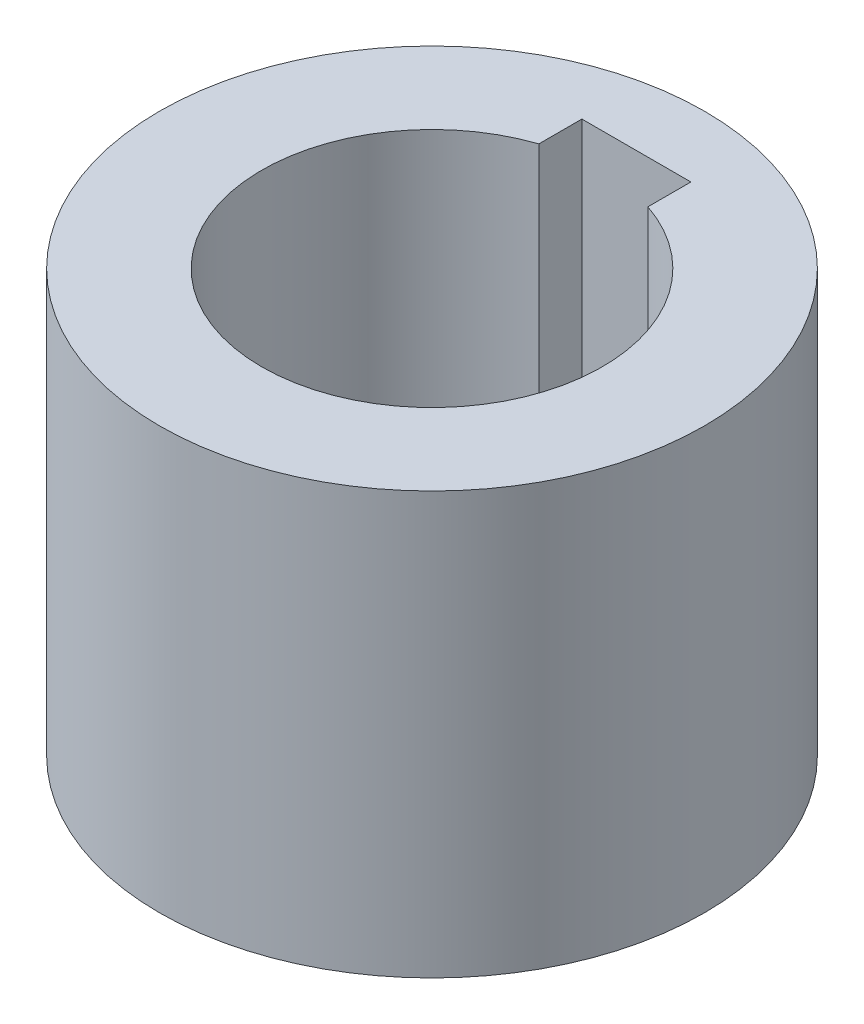
ISO-10303-21;
HEADER;
FILE_DESCRIPTION(('STEP AP214'),'2;1');
FILE_NAME('part.step','',(''),(''),'','','');
FILE_SCHEMA(('AUTOMOTIVE_DESIGN { 1 0 10303 214 1 1 1 1 }'));
ENDSEC;
DATA;
#1=APPLICATION_CONTEXT('core data for automotive mechanical design processes');
#2=APPLICATION_PROTOCOL_DEFINITION('international standard','automotive_design',2000,#1);
#3=PRODUCT_CONTEXT('',#1,'mechanical');
#4=PRODUCT('Part','Part','',(#3));
#5=PRODUCT_RELATED_PRODUCT_CATEGORY('part','',(#4));
#6=PRODUCT_DEFINITION_FORMATION('','',#4);
#7=PRODUCT_DEFINITION_CONTEXT('part definition',#1,'design');
#8=PRODUCT_DEFINITION('design','',#6,#7);
#9=PRODUCT_DEFINITION_SHAPE('','',#8);
#10=(LENGTH_UNIT() NAMED_UNIT(*) SI_UNIT(.MILLI.,.METRE.));
#11=(NAMED_UNIT(*) PLANE_ANGLE_UNIT() SI_UNIT($,.RADIAN.));
#12=(NAMED_UNIT(*) SI_UNIT($,.STERADIAN.) SOLID_ANGLE_UNIT());
#13=UNCERTAINTY_MEASURE_WITH_UNIT(LENGTH_MEASURE(1.E-05),#10,'distance_accuracy_value','');
#14=(GEOMETRIC_REPRESENTATION_CONTEXT(3) GLOBAL_UNCERTAINTY_ASSIGNED_CONTEXT((#13)) GLOBAL_UNIT_ASSIGNED_CONTEXT((#10,
#11,#12)) REPRESENTATION_CONTEXT('',''));
#15=CARTESIAN_POINT('',(0.,0.,0.));
#16=DIRECTION('',(0.,0.,1.));
#17=DIRECTION('',(1.,0.,0.));
#18=AXIS2_PLACEMENT_3D('',#15,#16,#17);
#19=CARTESIAN_POINT('',(0.,61.9,0.));
#20=DIRECTION('',(0.,1.,0.));
#21=DIRECTION('',(0.,0.,1.));
#22=AXIS2_PLACEMENT_3D('',#19,#20,#21);
#23=PLANE('',#22);
#24=DIRECTION('',(0.,0.,-1.));
#25=VECTOR('',#24,1.);
#26=CARTESIAN_POINT('',(8.,61.9,0.));
#27=LINE('',#26,#25);
#28=CARTESIAN_POINT('',(8.,61.9,-23.685438564654));
#29=VERTEX_POINT('',#28);
#30=CARTESIAN_POINT('',(8.,61.9,-30.));
#31=VERTEX_POINT('',#30);
#32=EDGE_CURVE('E76',#29,#31,#27,.T.);
#33=ORIENTED_EDGE('',*,*,#32,.F.);
#34=CARTESIAN_POINT('',(0.,61.9,0.));
#35=DIRECTION('',(0.,1.,0.));
#36=DIRECTION('',(0.,0.,1.));
#37=AXIS2_PLACEMENT_3D('',#34,#35,#36);
#38=CIRCLE('',#37,25.);
#39=CARTESIAN_POINT('',(-8.,61.9,-23.685438564654));
#40=VERTEX_POINT('',#39);
#41=EDGE_CURVE('E102',#40,#29,#38,.T.);
#42=ORIENTED_EDGE('',*,*,#41,.F.);
#43=DIRECTION('',(0.,0.,1.));
#44=VECTOR('',#43,1.);
#45=CARTESIAN_POINT('',(-8.,61.9,0.));
#46=LINE('',#45,#44);
#47=CARTESIAN_POINT('',(-8.,61.9,-30.));
#48=VERTEX_POINT('',#47);
#49=EDGE_CURVE('E48',#48,#40,#46,.T.);
#50=ORIENTED_EDGE('',*,*,#49,.F.);
#51=DIRECTION('',(-1.,0.,0.));
#52=VECTOR('',#51,1.);
#53=CARTESIAN_POINT('',(0.,61.9,-30.));
#54=LINE('',#53,#52);
#55=EDGE_CURVE('E100',#31,#48,#54,.T.);
#56=ORIENTED_EDGE('',*,*,#55,.F.);
#57=EDGE_LOOP('',(#33,#42,#50,#56));
#58=FACE_BOUND('',#57,.T.);
#59=CARTESIAN_POINT('',(0.,61.9,0.));
#60=DIRECTION('',(0.,1.,0.));
#61=DIRECTION('',(0.,0.,1.));
#62=AXIS2_PLACEMENT_3D('',#59,#60,#61);
#63=CIRCLE('',#62,40.);
#64=CARTESIAN_POINT('',(0.,61.9,40.));
#65=VERTEX_POINT('',#64);
#66=EDGE_CURVE('E107',#65,#65,#63,.T.);
#67=ORIENTED_EDGE('',*,*,#66,.T.);
#68=EDGE_LOOP('',(#67));
#69=FACE_BOUND('',#68,.T.);
#70=ADVANCED_FACE('F33',(#58,#69),#23,.T.);
#71=CARTESIAN_POINT('',(0.,0.,0.));
#72=DIRECTION('',(0.,1.,0.));
#73=DIRECTION('',(0.,0.,1.));
#74=AXIS2_PLACEMENT_3D('',#71,#72,#73);
#75=PLANE('',#74);
#76=CARTESIAN_POINT('',(0.,0.,0.));
#77=DIRECTION('',(0.,1.,0.));
#78=DIRECTION('',(0.,0.,1.));
#79=AXIS2_PLACEMENT_3D('',#76,#77,#78);
#80=CIRCLE('',#79,25.);
#81=CARTESIAN_POINT('',(-8.,0.,-23.685438564654));
#82=VERTEX_POINT('',#81);
#83=CARTESIAN_POINT('',(8.,0.,-23.685438564654));
#84=VERTEX_POINT('',#83);
#85=EDGE_CURVE('E93',#82,#84,#80,.T.);
#86=ORIENTED_EDGE('',*,*,#85,.T.);
#87=DIRECTION('',(0.,0.,-1.));
#88=VECTOR('',#87,1.);
#89=CARTESIAN_POINT('',(8.,0.,-20.));
#90=LINE('',#89,#88);
#91=CARTESIAN_POINT('',(8.,0.,-30.));
#92=VERTEX_POINT('',#91);
#93=EDGE_CURVE('E75',#84,#92,#90,.T.);
#94=ORIENTED_EDGE('',*,*,#93,.T.);
#95=DIRECTION('',(-1.,0.,0.));
#96=VECTOR('',#95,1.);
#97=CARTESIAN_POINT('',(-8.,0.,-30.));
#98=LINE('',#97,#96);
#99=CARTESIAN_POINT('',(-8.,0.,-30.));
#100=VERTEX_POINT('',#99);
#101=EDGE_CURVE('E83',#92,#100,#98,.T.);
#102=ORIENTED_EDGE('',*,*,#101,.T.);
#103=DIRECTION('',(0.,0.,1.));
#104=VECTOR('',#103,1.);
#105=CARTESIAN_POINT('',(-8.,0.,-20.));
#106=LINE('',#105,#104);
#107=EDGE_CURVE('E80',#100,#82,#106,.T.);
#108=ORIENTED_EDGE('',*,*,#107,.T.);
#109=EDGE_LOOP('',(#86,#94,#102,#108));
#110=FACE_BOUND('',#109,.T.);
#111=CARTESIAN_POINT('',(0.,0.,0.));
#112=DIRECTION('',(0.,1.,0.));
#113=DIRECTION('',(0.,0.,1.));
#114=AXIS2_PLACEMENT_3D('',#111,#112,#113);
#115=CIRCLE('',#114,40.);
#116=CARTESIAN_POINT('',(0.,0.,40.));
#117=VERTEX_POINT('',#116);
#118=EDGE_CURVE('E105',#117,#117,#115,.T.);
#119=ORIENTED_EDGE('',*,*,#118,.F.);
#120=EDGE_LOOP('',(#119));
#121=FACE_BOUND('',#120,.T.);
#122=ADVANCED_FACE('F90',(#110,#121),#75,.F.);
#123=CARTESIAN_POINT('',(0.,61.9,0.));
#124=DIRECTION('',(0.,-1.,0.));
#125=DIRECTION('',(0.,0.,-1.));
#126=AXIS2_PLACEMENT_3D('',#123,#124,#125);
#127=CYLINDRICAL_SURFACE('',#126,40.);
#128=ORIENTED_EDGE('',*,*,#66,.F.);
#129=EDGE_LOOP('',(#128));
#130=FACE_BOUND('',#129,.T.);
#131=ORIENTED_EDGE('',*,*,#118,.T.);
#132=EDGE_LOOP('',(#131));
#133=FACE_BOUND('',#132,.T.);
#134=ADVANCED_FACE('F35',(#130,#133),#127,.T.);
#135=CARTESIAN_POINT('',(0.,61.9,0.));
#136=DIRECTION('',(0.,-1.,0.));
#137=DIRECTION('',(0.,0.,-1.));
#138=AXIS2_PLACEMENT_3D('',#135,#136,#137);
#139=CYLINDRICAL_SURFACE('',#138,25.);
#140=DIRECTION('',(0.,-1.,0.));
#141=VECTOR('',#140,1.);
#142=CARTESIAN_POINT('',(8.,61.9,-23.685438564654));
#143=LINE('',#142,#141);
#144=EDGE_CURVE('E11',#84,#29,#143,.F.);
#145=ORIENTED_EDGE('',*,*,#144,.F.);
#146=ORIENTED_EDGE('',*,*,#85,.F.);
#147=DIRECTION('',(0.,-1.,0.));
#148=VECTOR('',#147,1.);
#149=CARTESIAN_POINT('',(-8.,61.9,-23.685438564654));
#150=LINE('',#149,#148);
#151=EDGE_CURVE('E41',#40,#82,#150,.T.);
#152=ORIENTED_EDGE('',*,*,#151,.F.);
#153=ORIENTED_EDGE('',*,*,#41,.T.);
#154=EDGE_LOOP('',(#145,#146,#152,#153));
#155=FACE_BOUND('',#154,.T.);
#156=ADVANCED_FACE('F114',(#155),#139,.F.);
#157=CARTESIAN_POINT('',(8.,0.,-20.));
#158=DIRECTION('',(1.,0.,0.));
#159=DIRECTION('',(0.,0.,-1.));
#160=AXIS2_PLACEMENT_3D('',#157,#158,#159);
#161=PLANE('',#160);
#162=ORIENTED_EDGE('',*,*,#32,.T.);
#163=DIRECTION('',(0.,1.,0.));
#164=VECTOR('',#163,1.);
#165=CARTESIAN_POINT('',(8.,0.,-30.));
#166=LINE('',#165,#164);
#167=EDGE_CURVE('E71',#92,#31,#166,.T.);
#168=ORIENTED_EDGE('',*,*,#167,.F.);
#169=ORIENTED_EDGE('',*,*,#93,.F.);
#170=ORIENTED_EDGE('',*,*,#144,.T.);
#171=EDGE_LOOP('',(#162,#168,#169,#170));
#172=FACE_BOUND('',#171,.T.);
#173=ADVANCED_FACE('F73',(#172),#161,.F.);
#174=CARTESIAN_POINT('',(-8.,0.,-20.));
#175=DIRECTION('',(-1.,0.,0.));
#176=DIRECTION('',(0.,0.,1.));
#177=AXIS2_PLACEMENT_3D('',#174,#175,#176);
#178=PLANE('',#177);
#179=ORIENTED_EDGE('',*,*,#49,.T.);
#180=ORIENTED_EDGE('',*,*,#151,.T.);
#181=ORIENTED_EDGE('',*,*,#107,.F.);
#182=DIRECTION('',(0.,1.,0.));
#183=VECTOR('',#182,1.);
#184=CARTESIAN_POINT('',(-8.,0.,-30.));
#185=LINE('',#184,#183);
#186=EDGE_CURVE('E79',#100,#48,#185,.T.);
#187=ORIENTED_EDGE('',*,*,#186,.T.);
#188=EDGE_LOOP('',(#179,#180,#181,#187));
#189=FACE_BOUND('',#188,.T.);
#190=ADVANCED_FACE('F111',(#189),#178,.F.);
#191=CARTESIAN_POINT('',(-8.,0.,-30.));
#192=DIRECTION('',(0.,0.,-1.));
#193=DIRECTION('',(-1.,0.,0.));
#194=AXIS2_PLACEMENT_3D('',#191,#192,#193);
#195=PLANE('',#194);
#196=ORIENTED_EDGE('',*,*,#55,.T.);
#197=ORIENTED_EDGE('',*,*,#186,.F.);
#198=ORIENTED_EDGE('',*,*,#101,.F.);
#199=ORIENTED_EDGE('',*,*,#167,.T.);
#200=EDGE_LOOP('',(#196,#197,#198,#199));
#201=FACE_BOUND('',#200,.T.);
#202=ADVANCED_FACE('F84',(#201),#195,.F.);
#203=CLOSED_SHELL('',(#70,#122,#134,#156,#173,#190,#202));
#204=MANIFOLD_SOLID_BREP('B2',#203);
#205=ADVANCED_BREP_SHAPE_REPRESENTATION('',(#18,#204),#14);
#206=SHAPE_DEFINITION_REPRESENTATION(#9,#205);
ENDSEC;
END-ISO-10303-21;
